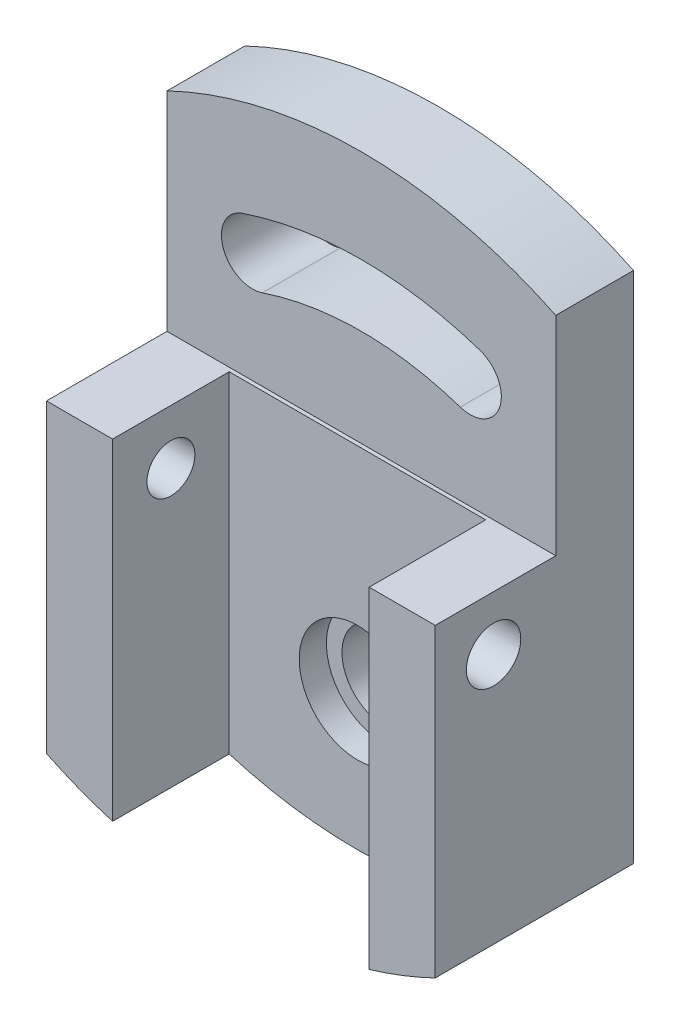
ISO-10303-21;
HEADER;
FILE_DESCRIPTION(('STEP AP214'),'2;1');
FILE_NAME('part.step','',(''),(''),'','','');
FILE_SCHEMA(('AUTOMOTIVE_DESIGN { 1 0 10303 214 1 1 1 1 }'));
ENDSEC;
DATA;
#1=APPLICATION_CONTEXT('core data for automotive mechanical design processes');
#2=APPLICATION_PROTOCOL_DEFINITION('international standard','automotive_design',2000,#1);
#3=PRODUCT_CONTEXT('',#1,'mechanical');
#4=PRODUCT('Part','Part','',(#3));
#5=PRODUCT_RELATED_PRODUCT_CATEGORY('part','',(#4));
#6=PRODUCT_DEFINITION_FORMATION('','',#4);
#7=PRODUCT_DEFINITION_CONTEXT('part definition',#1,'design');
#8=PRODUCT_DEFINITION('design','',#6,#7);
#9=PRODUCT_DEFINITION_SHAPE('','',#8);
#10=(LENGTH_UNIT() NAMED_UNIT(*) SI_UNIT(.MILLI.,.METRE.));
#11=(NAMED_UNIT(*) PLANE_ANGLE_UNIT() SI_UNIT($,.RADIAN.));
#12=(NAMED_UNIT(*) SI_UNIT($,.STERADIAN.) SOLID_ANGLE_UNIT());
#13=UNCERTAINTY_MEASURE_WITH_UNIT(LENGTH_MEASURE(1.E-05),#10,'distance_accuracy_value','');
#14=(GEOMETRIC_REPRESENTATION_CONTEXT(3) GLOBAL_UNCERTAINTY_ASSIGNED_CONTEXT((#13)) GLOBAL_UNIT_ASSIGNED_CONTEXT((#10,
#11,#12)) REPRESENTATION_CONTEXT('',''));
#15=CARTESIAN_POINT('',(0.,0.,0.));
#16=DIRECTION('',(0.,0.,1.));
#17=DIRECTION('',(1.,0.,0.));
#18=AXIS2_PLACEMENT_3D('',#15,#16,#17);
#19=CARTESIAN_POINT('',(0.,0.,20.));
#20=DIRECTION('',(0.,0.,1.));
#21=DIRECTION('',(1.,0.,0.));
#22=AXIS2_PLACEMENT_3D('',#19,#20,#21);
#23=PLANE('',#22);
#24=DIRECTION('',(0.,-1.,0.));
#25=VECTOR('',#24,1.);
#26=CARTESIAN_POINT('',(-50.,0.,20.));
#27=LINE('',#26,#25);
#28=CARTESIAN_POINT('',(-50.,108.56157588604,20.));
#29=VERTEX_POINT('',#28);
#30=CARTESIAN_POINT('',(-50.,55.,20.));
#31=VERTEX_POINT('',#30);
#32=EDGE_CURVE('E217',#29,#31,#27,.T.);
#33=ORIENTED_EDGE('',*,*,#32,.T.);
#34=DIRECTION('',(-1.,0.,0.));
#35=VECTOR('',#34,1.);
#36=CARTESIAN_POINT('',(50.,55.,20.));
#37=LINE('',#36,#35);
#38=CARTESIAN_POINT('',(50.,55.,20.));
#39=VERTEX_POINT('',#38);
#40=EDGE_CURVE('E179',#39,#31,#37,.T.);
#41=ORIENTED_EDGE('',*,*,#40,.F.);
#42=DIRECTION('',(0.,-1.,0.));
#43=VECTOR('',#42,1.);
#44=CARTESIAN_POINT('',(50.,0.,20.));
#45=LINE('',#44,#43);
#46=CARTESIAN_POINT('',(50.,108.56157588604,20.));
#47=VERTEX_POINT('',#46);
#48=EDGE_CURVE('E222',#47,#39,#45,.T.);
#49=ORIENTED_EDGE('',*,*,#48,.F.);
#50=CARTESIAN_POINT('',(0.,4.99999999999999,20.));
#51=DIRECTION('',(0.,0.,1.));
#52=DIRECTION('',(1.,0.,0.));
#53=AXIS2_PLACEMENT_3D('',#50,#51,#52);
#54=CIRCLE('',#53,115.);
#55=EDGE_CURVE('E213',#29,#47,#54,.F.);
#56=ORIENTED_EDGE('',*,*,#55,.F.);
#57=EDGE_LOOP('',(#33,#41,#49,#56));
#58=FACE_BOUND('',#57,.T.);
#59=CARTESIAN_POINT('',(28.,83.4266144584569,20.));
#60=DIRECTION('',(0.,0.,1.));
#61=DIRECTION('',(1.,0.,0.));
#62=AXIS2_PLACEMENT_3D('',#59,#60,#61);
#63=CIRCLE('',#62,7.99999999999999);
#64=CARTESIAN_POINT('',(25.4545454545455,75.8423767804153,20.));
#65=VERTEX_POINT('',#64);
#66=CARTESIAN_POINT('',(30.5454545454545,91.0108521364984,20.));
#67=VERTEX_POINT('',#66);
#68=EDGE_CURVE('E61',#65,#67,#63,.T.);
#69=ORIENTED_EDGE('',*,*,#68,.F.);
#70=CARTESIAN_POINT('',(0.,0.,20.));
#71=DIRECTION('',(0.,0.,-1.));
#72=DIRECTION('',(1.,0.,0.));
#73=AXIS2_PLACEMENT_3D('',#70,#71,#72);
#74=CIRCLE('',#73,80.);
#75=CARTESIAN_POINT('',(-25.4545454545455,75.8423767804153,20.));
#76=VERTEX_POINT('',#75);
#77=EDGE_CURVE('E289',#76,#65,#74,.T.);
#78=ORIENTED_EDGE('',*,*,#77,.F.);
#79=CARTESIAN_POINT('',(-28.,83.4266144584568,20.));
#80=DIRECTION('',(0.,0.,1.));
#81=DIRECTION('',(1.,0.,0.));
#82=AXIS2_PLACEMENT_3D('',#79,#80,#81);
#83=CIRCLE('',#82,7.99999999999999);
#84=CARTESIAN_POINT('',(-30.5454545454545,91.0108521364983,20.));
#85=VERTEX_POINT('',#84);
#86=EDGE_CURVE('E306',#85,#76,#83,.T.);
#87=ORIENTED_EDGE('',*,*,#86,.F.);
#88=CARTESIAN_POINT('',(0.,0.,20.));
#89=DIRECTION('',(0.,0.,1.));
#90=DIRECTION('',(1.,0.,0.));
#91=AXIS2_PLACEMENT_3D('',#88,#89,#90);
#92=CIRCLE('',#91,96.);
#93=EDGE_CURVE('E302',#67,#85,#92,.T.);
#94=ORIENTED_EDGE('',*,*,#93,.F.);
#95=EDGE_LOOP('',(#69,#78,#87,#94));
#96=FACE_BOUND('',#95,.T.);
#97=ADVANCED_FACE('F44',(#58,#96),#23,.T.);
#98=CARTESIAN_POINT('',(0.,4.99999999999999,20.));
#99=DIRECTION('',(0.,0.,-1.));
#100=DIRECTION('',(-1.,0.,0.));
#101=AXIS2_PLACEMENT_3D('',#98,#99,#100);
#102=CYLINDRICAL_SURFACE('',#101,115.);
#103=CARTESIAN_POINT('',(0.,4.99999999999999,0.));
#104=DIRECTION('',(0.,0.,1.));
#105=DIRECTION('',(1.,0.,0.));
#106=AXIS2_PLACEMENT_3D('',#103,#104,#105);
#107=CIRCLE('',#106,115.);
#108=CARTESIAN_POINT('',(-50.,108.56157588604,0.));
#109=VERTEX_POINT('',#108);
#110=CARTESIAN_POINT('',(50.,108.56157588604,0.));
#111=VERTEX_POINT('',#110);
#112=EDGE_CURVE('E212',#109,#111,#107,.F.);
#113=ORIENTED_EDGE('',*,*,#112,.F.);
#114=DIRECTION('',(0.,0.,-1.));
#115=VECTOR('',#114,1.);
#116=CARTESIAN_POINT('',(-50.,108.56157588604,20.));
#117=LINE('',#116,#115);
#118=EDGE_CURVE('E12',#29,#109,#117,.T.);
#119=ORIENTED_EDGE('',*,*,#118,.F.);
#120=ORIENTED_EDGE('',*,*,#55,.T.);
#121=DIRECTION('',(0.,0.,-1.));
#122=VECTOR('',#121,1.);
#123=CARTESIAN_POINT('',(50.,108.56157588604,20.));
#124=LINE('',#123,#122);
#125=EDGE_CURVE('E226',#47,#111,#124,.T.);
#126=ORIENTED_EDGE('',*,*,#125,.T.);
#127=EDGE_LOOP('',(#113,#119,#120,#126));
#128=FACE_BOUND('',#127,.T.);
#129=ADVANCED_FACE('F46',(#128),#102,.T.);
#130=CARTESIAN_POINT('',(-50.,0.,20.));
#131=DIRECTION('',(1.,0.,0.));
#132=DIRECTION('',(0.,1.,0.));
#133=AXIS2_PLACEMENT_3D('',#130,#131,#132);
#134=PLANE('',#133);
#135=CARTESIAN_POINT('',(-50.,41.,36.));
#136=DIRECTION('',(-1.,0.,0.));
#137=DIRECTION('',(0.,-1.,0.));
#138=AXIS2_PLACEMENT_3D('',#135,#136,#137);
#139=CIRCLE('',#138,6.);
#140=CARTESIAN_POINT('',(-50.,35.,36.));
#141=VERTEX_POINT('',#140);
#142=EDGE_CURVE('E316',#141,#141,#139,.T.);
#143=ORIENTED_EDGE('',*,*,#142,.F.);
#144=EDGE_LOOP('',(#143));
#145=FACE_BOUND('',#144,.T.);
#146=DIRECTION('',(0.,-1.,0.));
#147=VECTOR('',#146,1.);
#148=CARTESIAN_POINT('',(-50.,0.,0.));
#149=LINE('',#148,#147);
#150=CARTESIAN_POINT('',(-50.,-23.5615758860399,0.));
#151=VERTEX_POINT('',#150);
#152=EDGE_CURVE('E230',#109,#151,#149,.T.);
#153=ORIENTED_EDGE('',*,*,#152,.T.);
#154=DIRECTION('',(0.,0.,-1.));
#155=VECTOR('',#154,1.);
#156=CARTESIAN_POINT('',(-50.,-23.5615758860399,20.));
#157=LINE('',#156,#155);
#158=CARTESIAN_POINT('',(-50.,-23.5615758860399,51.));
#159=VERTEX_POINT('',#158);
#160=EDGE_CURVE('E54',#159,#151,#157,.T.);
#161=ORIENTED_EDGE('',*,*,#160,.F.);
#162=DIRECTION('',(0.,-1.,0.));
#163=VECTOR('',#162,1.);
#164=CARTESIAN_POINT('',(-50.,55.,51.));
#165=LINE('',#164,#163);
#166=CARTESIAN_POINT('',(-50.,55.,51.));
#167=VERTEX_POINT('',#166);
#168=EDGE_CURVE('E182',#167,#159,#165,.T.);
#169=ORIENTED_EDGE('',*,*,#168,.F.);
#170=DIRECTION('',(0.,0.,-1.));
#171=VECTOR('',#170,1.);
#172=CARTESIAN_POINT('',(-50.,55.,51.));
#173=LINE('',#172,#171);
#174=EDGE_CURVE('E174',#167,#31,#173,.T.);
#175=ORIENTED_EDGE('',*,*,#174,.T.);
#176=ORIENTED_EDGE('',*,*,#32,.F.);
#177=ORIENTED_EDGE('',*,*,#118,.T.);
#178=EDGE_LOOP('',(#153,#161,#169,#175,#176,#177));
#179=FACE_BOUND('',#178,.T.);
#180=ADVANCED_FACE('F358',(#145,#179),#134,.F.);
#181=CARTESIAN_POINT('',(0.,80.,20.));
#182=DIRECTION('',(0.,0.,-1.));
#183=DIRECTION('',(-1.,0.,0.));
#184=AXIS2_PLACEMENT_3D('',#181,#182,#183);
#185=CYLINDRICAL_SURFACE('',#184,115.);
#186=CARTESIAN_POINT('',(0.,80.,0.));
#187=DIRECTION('',(0.,0.,1.));
#188=DIRECTION('',(1.,0.,0.));
#189=AXIS2_PLACEMENT_3D('',#186,#187,#188);
#190=CIRCLE('',#189,115.);
#191=CARTESIAN_POINT('',(50.,-23.5615758860399,0.));
#192=VERTEX_POINT('',#191);
#193=EDGE_CURVE('E233',#151,#192,#190,.T.);
#194=ORIENTED_EDGE('',*,*,#193,.T.);
#195=DIRECTION('',(0.,0.,-1.));
#196=VECTOR('',#195,1.);
#197=CARTESIAN_POINT('',(50.,-23.5615758860399,20.));
#198=LINE('',#197,#196);
#199=CARTESIAN_POINT('',(50.,-23.5615758860399,51.));
#200=VERTEX_POINT('',#199);
#201=EDGE_CURVE('E242',#200,#192,#198,.T.);
#202=ORIENTED_EDGE('',*,*,#201,.F.);
#203=CARTESIAN_POINT('',(0.,80.,51.));
#204=DIRECTION('',(0.,0.,1.));
#205=DIRECTION('',(-1.,0.,0.));
#206=AXIS2_PLACEMENT_3D('',#203,#204,#205);
#207=CIRCLE('',#206,115.);
#208=CARTESIAN_POINT('',(33.,-30.1635148313633,51.));
#209=VERTEX_POINT('',#208);
#210=EDGE_CURVE('E186',#209,#200,#207,.T.);
#211=ORIENTED_EDGE('',*,*,#210,.F.);
#212=DIRECTION('',(0.,0.,-1.));
#213=VECTOR('',#212,1.);
#214=CARTESIAN_POINT('',(33.,-30.1635148313633,51.));
#215=LINE('',#214,#213);
#216=CARTESIAN_POINT('',(33.,-30.1635148313633,21.));
#217=VERTEX_POINT('',#216);
#218=EDGE_CURVE('E199',#209,#217,#215,.T.);
#219=ORIENTED_EDGE('',*,*,#218,.T.);
#220=CARTESIAN_POINT('',(0.,80.,21.));
#221=DIRECTION('',(0.,0.,1.));
#222=DIRECTION('',(1.,0.,0.));
#223=AXIS2_PLACEMENT_3D('',#220,#221,#222);
#224=CIRCLE('',#223,115.);
#225=CARTESIAN_POINT('',(-33.,-30.1635148313633,21.));
#226=VERTEX_POINT('',#225);
#227=EDGE_CURVE('E168',#226,#217,#224,.T.);
#228=ORIENTED_EDGE('',*,*,#227,.F.);
#229=DIRECTION('',(0.,0.,-1.));
#230=VECTOR('',#229,1.);
#231=CARTESIAN_POINT('',(-33.,-30.1635148313633,51.));
#232=LINE('',#231,#230);
#233=CARTESIAN_POINT('',(-33.,-30.1635148313633,51.));
#234=VERTEX_POINT('',#233);
#235=EDGE_CURVE('E166',#234,#226,#232,.T.);
#236=ORIENTED_EDGE('',*,*,#235,.F.);
#237=CARTESIAN_POINT('',(0.,80.,51.));
#238=DIRECTION('',(0.,0.,1.));
#239=DIRECTION('',(1.,0.,0.));
#240=AXIS2_PLACEMENT_3D('',#237,#238,#239);
#241=CIRCLE('',#240,115.);
#242=EDGE_CURVE('E253',#159,#234,#241,.T.);
#243=ORIENTED_EDGE('',*,*,#242,.F.);
#244=ORIENTED_EDGE('',*,*,#160,.T.);
#245=EDGE_LOOP('',(#194,#202,#211,#219,#228,#236,#243,#244));
#246=FACE_BOUND('',#245,.T.);
#247=ADVANCED_FACE('F251',(#246),#185,.T.);
#248=CARTESIAN_POINT('',(50.,0.,20.));
#249=DIRECTION('',(1.,0.,0.));
#250=DIRECTION('',(0.,1.,0.));
#251=AXIS2_PLACEMENT_3D('',#248,#249,#250);
#252=PLANE('',#251);
#253=CARTESIAN_POINT('',(50.,41.,36.));
#254=DIRECTION('',(1.,0.,0.));
#255=DIRECTION('',(0.,1.,0.));
#256=AXIS2_PLACEMENT_3D('',#253,#254,#255);
#257=CIRCLE('',#256,7.);
#258=CARTESIAN_POINT('',(50.,48.,36.));
#259=VERTEX_POINT('',#258);
#260=EDGE_CURVE('E328',#259,#259,#257,.T.);
#261=ORIENTED_EDGE('',*,*,#260,.F.);
#262=EDGE_LOOP('',(#261));
#263=FACE_BOUND('',#262,.T.);
#264=DIRECTION('',(0.,-1.,0.));
#265=VECTOR('',#264,1.);
#266=CARTESIAN_POINT('',(50.,0.,0.));
#267=LINE('',#266,#265);
#268=EDGE_CURVE('E218',#111,#192,#267,.T.);
#269=ORIENTED_EDGE('',*,*,#268,.F.);
#270=ORIENTED_EDGE('',*,*,#125,.F.);
#271=ORIENTED_EDGE('',*,*,#48,.T.);
#272=DIRECTION('',(0.,0.,-1.));
#273=VECTOR('',#272,1.);
#274=CARTESIAN_POINT('',(50.,55.,51.));
#275=LINE('',#274,#273);
#276=CARTESIAN_POINT('',(50.,55.,51.));
#277=VERTEX_POINT('',#276);
#278=EDGE_CURVE('E208',#277,#39,#275,.T.);
#279=ORIENTED_EDGE('',*,*,#278,.F.);
#280=DIRECTION('',(0.,1.,0.));
#281=VECTOR('',#280,1.);
#282=CARTESIAN_POINT('',(50.,55.,51.));
#283=LINE('',#282,#281);
#284=EDGE_CURVE('E190',#200,#277,#283,.T.);
#285=ORIENTED_EDGE('',*,*,#284,.F.);
#286=ORIENTED_EDGE('',*,*,#201,.T.);
#287=EDGE_LOOP('',(#269,#270,#271,#279,#285,#286));
#288=FACE_BOUND('',#287,.T.);
#289=ADVANCED_FACE('F263',(#263,#288),#252,.T.);
#290=CARTESIAN_POINT('',(0.,0.,0.));
#291=DIRECTION('',(0.,0.,1.));
#292=DIRECTION('',(1.,0.,0.));
#293=AXIS2_PLACEMENT_3D('',#290,#291,#292);
#294=PLANE('',#293);
#295=CARTESIAN_POINT('',(0.,0.,0.));
#296=DIRECTION('',(0.,0.,-1.));
#297=DIRECTION('',(1.,0.,0.));
#298=AXIS2_PLACEMENT_3D('',#295,#296,#297);
#299=CIRCLE('',#298,80.);
#300=CARTESIAN_POINT('',(-25.4545454545455,75.8423767804153,0.));
#301=VERTEX_POINT('',#300);
#302=CARTESIAN_POINT('',(25.4545454545455,75.8423767804153,0.));
#303=VERTEX_POINT('',#302);
#304=EDGE_CURVE('E295',#301,#303,#299,.T.);
#305=ORIENTED_EDGE('',*,*,#304,.T.);
#306=CARTESIAN_POINT('',(28.,83.4266144584569,0.));
#307=DIRECTION('',(0.,0.,1.));
#308=DIRECTION('',(1.,0.,0.));
#309=AXIS2_PLACEMENT_3D('',#306,#307,#308);
#310=CIRCLE('',#309,7.99999999999999);
#311=CARTESIAN_POINT('',(30.5454545454545,91.0108521364984,0.));
#312=VERTEX_POINT('',#311);
#313=EDGE_CURVE('E284',#303,#312,#310,.T.);
#314=ORIENTED_EDGE('',*,*,#313,.T.);
#315=CARTESIAN_POINT('',(0.,0.,0.));
#316=DIRECTION('',(0.,0.,1.));
#317=DIRECTION('',(1.,0.,0.));
#318=AXIS2_PLACEMENT_3D('',#315,#316,#317);
#319=CIRCLE('',#318,96.);
#320=CARTESIAN_POINT('',(-30.5454545454545,91.0108521364983,0.));
#321=VERTEX_POINT('',#320);
#322=EDGE_CURVE('E288',#312,#321,#319,.T.);
#323=ORIENTED_EDGE('',*,*,#322,.T.);
#324=CARTESIAN_POINT('',(-28.,83.4266144584568,0.));
#325=DIRECTION('',(0.,0.,1.));
#326=DIRECTION('',(1.,0.,0.));
#327=AXIS2_PLACEMENT_3D('',#324,#325,#326);
#328=CIRCLE('',#327,7.99999999999999);
#329=EDGE_CURVE('E69',#321,#301,#328,.T.);
#330=ORIENTED_EDGE('',*,*,#329,.T.);
#331=EDGE_LOOP('',(#305,#314,#323,#330));
#332=FACE_BOUND('',#331,.T.);
#333=CARTESIAN_POINT('',(0.,0.,0.));
#334=DIRECTION('',(0.,0.,1.));
#335=DIRECTION('',(1.,0.,0.));
#336=AXIS2_PLACEMENT_3D('',#333,#334,#335);
#337=CIRCLE('',#336,11.);
#338=CARTESIAN_POINT('',(11.,0.,0.));
#339=VERTEX_POINT('',#338);
#340=EDGE_CURVE('E336',#339,#339,#337,.T.);
#341=ORIENTED_EDGE('',*,*,#340,.T.);
#342=EDGE_LOOP('',(#341));
#343=FACE_BOUND('',#342,.T.);
#344=ORIENTED_EDGE('',*,*,#112,.T.);
#345=ORIENTED_EDGE('',*,*,#268,.T.);
#346=ORIENTED_EDGE('',*,*,#193,.F.);
#347=ORIENTED_EDGE('',*,*,#152,.F.);
#348=EDGE_LOOP('',(#344,#345,#346,#347));
#349=FACE_BOUND('',#348,.T.);
#350=ADVANCED_FACE('F259',(#332,#343,#349),#294,.F.);
#351=CARTESIAN_POINT('',(50.,55.,51.));
#352=DIRECTION('',(0.,-1.,0.));
#353=DIRECTION('',(0.,0.,-1.));
#354=AXIS2_PLACEMENT_3D('',#351,#352,#353);
#355=PLANE('',#354);
#356=ORIENTED_EDGE('',*,*,#40,.T.);
#357=ORIENTED_EDGE('',*,*,#174,.F.);
#358=DIRECTION('',(-1.,0.,0.));
#359=VECTOR('',#358,1.);
#360=CARTESIAN_POINT('',(-50.,55.,51.));
#361=LINE('',#360,#359);
#362=CARTESIAN_POINT('',(-33.,55.,51.));
#363=VERTEX_POINT('',#362);
#364=EDGE_CURVE('E172',#363,#167,#361,.T.);
#365=ORIENTED_EDGE('',*,*,#364,.F.);
#366=DIRECTION('',(0.,0.,-1.));
#367=VECTOR('',#366,1.);
#368=CARTESIAN_POINT('',(-33.,55.,51.));
#369=LINE('',#368,#367);
#370=CARTESIAN_POINT('',(-33.,55.,21.));
#371=VERTEX_POINT('',#370);
#372=EDGE_CURVE('E163',#363,#371,#369,.T.);
#373=ORIENTED_EDGE('',*,*,#372,.T.);
#374=DIRECTION('',(1.,0.,0.));
#375=VECTOR('',#374,1.);
#376=CARTESIAN_POINT('',(0.,55.,21.));
#377=LINE('',#376,#375);
#378=CARTESIAN_POINT('',(33.,55.,21.));
#379=VERTEX_POINT('',#378);
#380=EDGE_CURVE('E145',#371,#379,#377,.T.);
#381=ORIENTED_EDGE('',*,*,#380,.T.);
#382=DIRECTION('',(0.,0.,-1.));
#383=VECTOR('',#382,1.);
#384=CARTESIAN_POINT('',(33.,55.,51.));
#385=LINE('',#384,#383);
#386=CARTESIAN_POINT('',(33.,55.,51.));
#387=VERTEX_POINT('',#386);
#388=EDGE_CURVE('E205',#387,#379,#385,.T.);
#389=ORIENTED_EDGE('',*,*,#388,.F.);
#390=DIRECTION('',(-1.,0.,0.));
#391=VECTOR('',#390,1.);
#392=CARTESIAN_POINT('',(50.,55.,51.));
#393=LINE('',#392,#391);
#394=EDGE_CURVE('E193',#277,#387,#393,.T.);
#395=ORIENTED_EDGE('',*,*,#394,.F.);
#396=ORIENTED_EDGE('',*,*,#278,.T.);
#397=EDGE_LOOP('',(#356,#357,#365,#373,#381,#389,#395,#396));
#398=FACE_BOUND('',#397,.T.);
#399=ADVANCED_FACE('F170',(#398),#355,.F.);
#400=CARTESIAN_POINT('',(33.,55.,51.));
#401=DIRECTION('',(1.,0.,0.));
#402=DIRECTION('',(0.,1.,0.));
#403=AXIS2_PLACEMENT_3D('',#400,#401,#402);
#404=PLANE('',#403);
#405=CARTESIAN_POINT('',(33.,41.,36.));
#406=DIRECTION('',(1.,0.,0.));
#407=DIRECTION('',(0.,1.,0.));
#408=AXIS2_PLACEMENT_3D('',#405,#406,#407);
#409=CIRCLE('',#408,6.83);
#410=CARTESIAN_POINT('',(33.,47.83,36.));
#411=VERTEX_POINT('',#410);
#412=EDGE_CURVE('E332',#411,#411,#409,.T.);
#413=ORIENTED_EDGE('',*,*,#412,.T.);
#414=EDGE_LOOP('',(#413));
#415=FACE_BOUND('',#414,.T.);
#416=ORIENTED_EDGE('',*,*,#388,.T.);
#417=DIRECTION('',(0.,1.,0.));
#418=VECTOR('',#417,1.);
#419=CARTESIAN_POINT('',(33.,0.,21.));
#420=LINE('',#419,#418);
#421=EDGE_CURVE('E152',#217,#379,#420,.T.);
#422=ORIENTED_EDGE('',*,*,#421,.F.);
#423=ORIENTED_EDGE('',*,*,#218,.F.);
#424=DIRECTION('',(0.,-1.,0.));
#425=VECTOR('',#424,1.);
#426=CARTESIAN_POINT('',(33.,55.,51.));
#427=LINE('',#426,#425);
#428=EDGE_CURVE('E196',#387,#209,#427,.T.);
#429=ORIENTED_EDGE('',*,*,#428,.F.);
#430=EDGE_LOOP('',(#416,#422,#423,#429));
#431=FACE_BOUND('',#430,.T.);
#432=ADVANCED_FACE('F273',(#415,#431),#404,.F.);
#433=CARTESIAN_POINT('',(0.,80.,51.));
#434=DIRECTION('',(0.,0.,-1.));
#435=DIRECTION('',(-1.,0.,0.));
#436=AXIS2_PLACEMENT_3D('',#433,#434,#435);
#437=PLANE('',#436);
#438=ORIENTED_EDGE('',*,*,#210,.T.);
#439=ORIENTED_EDGE('',*,*,#284,.T.);
#440=ORIENTED_EDGE('',*,*,#394,.T.);
#441=ORIENTED_EDGE('',*,*,#428,.T.);
#442=EDGE_LOOP('',(#438,#439,#440,#441));
#443=FACE_BOUND('',#442,.T.);
#444=ADVANCED_FACE('F269',(#443),#437,.F.);
#445=CARTESIAN_POINT('',(-33.,55.,51.));
#446=DIRECTION('',(-1.,0.,0.));
#447=DIRECTION('',(0.,-1.,0.));
#448=AXIS2_PLACEMENT_3D('',#445,#446,#447);
#449=PLANE('',#448);
#450=CARTESIAN_POINT('',(-33.,41.,36.));
#451=DIRECTION('',(-1.,0.,0.));
#452=DIRECTION('',(0.,-1.,0.));
#453=AXIS2_PLACEMENT_3D('',#450,#451,#452);
#454=CIRCLE('',#453,6.17);
#455=CARTESIAN_POINT('',(-33.,34.83,36.));
#456=VERTEX_POINT('',#455);
#457=EDGE_CURVE('E48',#456,#456,#454,.T.);
#458=ORIENTED_EDGE('',*,*,#457,.T.);
#459=EDGE_LOOP('',(#458));
#460=FACE_BOUND('',#459,.T.);
#461=ORIENTED_EDGE('',*,*,#235,.T.);
#462=DIRECTION('',(0.,-1.,0.));
#463=VECTOR('',#462,1.);
#464=CARTESIAN_POINT('',(-33.,0.,21.));
#465=LINE('',#464,#463);
#466=EDGE_CURVE('E149',#371,#226,#465,.T.);
#467=ORIENTED_EDGE('',*,*,#466,.F.);
#468=ORIENTED_EDGE('',*,*,#372,.F.);
#469=DIRECTION('',(0.,1.,0.));
#470=VECTOR('',#469,1.);
#471=CARTESIAN_POINT('',(-33.,55.,51.));
#472=LINE('',#471,#470);
#473=EDGE_CURVE('E350',#234,#363,#472,.T.);
#474=ORIENTED_EDGE('',*,*,#473,.F.);
#475=EDGE_LOOP('',(#461,#467,#468,#474));
#476=FACE_BOUND('',#475,.T.);
#477=ADVANCED_FACE('F162',(#460,#476),#449,.F.);
#478=CARTESIAN_POINT('',(0.,80.,51.));
#479=DIRECTION('',(0.,0.,1.));
#480=DIRECTION('',(1.,0.,0.));
#481=AXIS2_PLACEMENT_3D('',#478,#479,#480);
#482=PLANE('',#481);
#483=ORIENTED_EDGE('',*,*,#242,.T.);
#484=ORIENTED_EDGE('',*,*,#473,.T.);
#485=ORIENTED_EDGE('',*,*,#364,.T.);
#486=ORIENTED_EDGE('',*,*,#168,.T.);
#487=EDGE_LOOP('',(#483,#484,#485,#486));
#488=FACE_BOUND('',#487,.T.);
#489=ADVANCED_FACE('F357',(#488),#482,.T.);
#490=CARTESIAN_POINT('',(0.,0.,14.));
#491=DIRECTION('',(0.,0.,1.));
#492=DIRECTION('',(1.,0.,0.));
#493=AXIS2_PLACEMENT_3D('',#490,#491,#492);
#494=CYLINDRICAL_SURFACE('',#493,15.);
#495=CARTESIAN_POINT('',(0.,0.,14.));
#496=DIRECTION('',(0.,0.,1.));
#497=DIRECTION('',(1.,0.,0.));
#498=AXIS2_PLACEMENT_3D('',#495,#496,#497);
#499=CIRCLE('',#498,15.);
#500=CARTESIAN_POINT('',(15.,0.,14.));
#501=VERTEX_POINT('',#500);
#502=EDGE_CURVE('E344',#501,#501,#499,.T.);
#503=ORIENTED_EDGE('',*,*,#502,.F.);
#504=EDGE_LOOP('',(#503));
#505=FACE_BOUND('',#504,.T.);
#506=CARTESIAN_POINT('',(0.,0.,21.));
#507=DIRECTION('',(0.,0.,1.));
#508=DIRECTION('',(1.,0.,0.));
#509=AXIS2_PLACEMENT_3D('',#506,#507,#508);
#510=CIRCLE('',#509,15.);
#511=CARTESIAN_POINT('',(15.,0.,21.));
#512=VERTEX_POINT('',#511);
#513=EDGE_CURVE('E275',#512,#512,#510,.F.);
#514=ORIENTED_EDGE('',*,*,#513,.F.);
#515=EDGE_LOOP('',(#514));
#516=FACE_BOUND('',#515,.T.);
#517=ADVANCED_FACE('F426',(#505,#516),#494,.F.);
#518=CARTESIAN_POINT('',(0.,0.,14.));
#519=DIRECTION('',(0.,0.,1.));
#520=DIRECTION('',(1.,0.,0.));
#521=AXIS2_PLACEMENT_3D('',#518,#519,#520);
#522=PLANE('',#521);
#523=CARTESIAN_POINT('',(0.,0.,14.));
#524=DIRECTION('',(0.,0.,1.));
#525=DIRECTION('',(1.,0.,0.));
#526=AXIS2_PLACEMENT_3D('',#523,#524,#525);
#527=CIRCLE('',#526,11.);
#528=CARTESIAN_POINT('',(11.,0.,14.));
#529=VERTEX_POINT('',#528);
#530=EDGE_CURVE('E340',#529,#529,#527,.T.);
#531=ORIENTED_EDGE('',*,*,#530,.F.);
#532=EDGE_LOOP('',(#531));
#533=FACE_BOUND('',#532,.T.);
#534=ORIENTED_EDGE('',*,*,#502,.T.);
#535=EDGE_LOOP('',(#534));
#536=FACE_BOUND('',#535,.T.);
#537=ADVANCED_FACE('F433',(#533,#536),#522,.T.);
#538=CARTESIAN_POINT('',(0.,0.,0.));
#539=DIRECTION('',(0.,0.,1.));
#540=DIRECTION('',(1.,0.,0.));
#541=AXIS2_PLACEMENT_3D('',#538,#539,#540);
#542=CYLINDRICAL_SURFACE('',#541,11.);
#543=ORIENTED_EDGE('',*,*,#530,.T.);
#544=EDGE_LOOP('',(#543));
#545=FACE_BOUND('',#544,.T.);
#546=ORIENTED_EDGE('',*,*,#340,.F.);
#547=EDGE_LOOP('',(#546));
#548=FACE_BOUND('',#547,.T.);
#549=ADVANCED_FACE('F441',(#545,#548),#542,.F.);
#550=CARTESIAN_POINT('',(-50.,41.,36.));
#551=DIRECTION('',(1.,0.,0.));
#552=DIRECTION('',(0.,1.,0.));
#553=AXIS2_PLACEMENT_3D('',#550,#551,#552);
#554=CONICAL_SURFACE('',#553,6.,0.00999966668666519);
#555=ORIENTED_EDGE('',*,*,#142,.T.);
#556=EDGE_LOOP('',(#555));
#557=FACE_BOUND('',#556,.T.);
#558=ORIENTED_EDGE('',*,*,#457,.F.);
#559=EDGE_LOOP('',(#558));
#560=FACE_BOUND('',#559,.T.);
#561=ADVANCED_FACE('F449',(#557,#560),#554,.F.);
#562=ORIENTED_EDGE('',*,*,#260,.T.);
#563=EDGE_LOOP('',(#562));
#564=FACE_BOUND('',#563,.T.);
#565=ORIENTED_EDGE('',*,*,#412,.F.);
#566=EDGE_LOOP('',(#565));
#567=FACE_BOUND('',#566,.T.);
#568=ADVANCED_FACE('F457',(#564,#567),#554,.F.);
#569=CARTESIAN_POINT('',(28.,83.4266144584569,0.));
#570=DIRECTION('',(0.,0.,1.));
#571=DIRECTION('',(1.,0.,0.));
#572=AXIS2_PLACEMENT_3D('',#569,#570,#571);
#573=CYLINDRICAL_SURFACE('',#572,7.99999999999999);
#574=ORIENTED_EDGE('',*,*,#68,.T.);
#575=DIRECTION('',(0.,0.,1.));
#576=VECTOR('',#575,1.);
#577=CARTESIAN_POINT('',(30.5454545454545,91.0108521364984,0.));
#578=LINE('',#577,#576);
#579=EDGE_CURVE('E299',#312,#67,#578,.T.);
#580=ORIENTED_EDGE('',*,*,#579,.F.);
#581=ORIENTED_EDGE('',*,*,#313,.F.);
#582=DIRECTION('',(0.,0.,1.));
#583=VECTOR('',#582,1.);
#584=CARTESIAN_POINT('',(25.4545454545455,75.8423767804153,0.));
#585=LINE('',#584,#583);
#586=EDGE_CURVE('E313',#303,#65,#585,.T.);
#587=ORIENTED_EDGE('',*,*,#586,.T.);
#588=EDGE_LOOP('',(#574,#580,#581,#587));
#589=FACE_BOUND('',#588,.T.);
#590=ADVANCED_FACE('F465',(#589),#573,.F.);
#591=CARTESIAN_POINT('',(0.,0.,0.));
#592=DIRECTION('',(0.,0.,1.));
#593=DIRECTION('',(1.,0.,0.));
#594=AXIS2_PLACEMENT_3D('',#591,#592,#593);
#595=CYLINDRICAL_SURFACE('',#594,80.);
#596=ORIENTED_EDGE('',*,*,#77,.T.);
#597=ORIENTED_EDGE('',*,*,#586,.F.);
#598=ORIENTED_EDGE('',*,*,#304,.F.);
#599=DIRECTION('',(0.,0.,1.));
#600=VECTOR('',#599,1.);
#601=CARTESIAN_POINT('',(-25.4545454545455,75.8423767804153,0.));
#602=LINE('',#601,#600);
#603=EDGE_CURVE('E317',#301,#76,#602,.T.);
#604=ORIENTED_EDGE('',*,*,#603,.T.);
#605=EDGE_LOOP('',(#596,#597,#598,#604));
#606=FACE_BOUND('',#605,.T.);
#607=ADVANCED_FACE('F472',(#606),#595,.T.);
#608=CARTESIAN_POINT('',(-28.,83.4266144584568,0.));
#609=DIRECTION('',(0.,0.,1.));
#610=DIRECTION('',(1.,0.,0.));
#611=AXIS2_PLACEMENT_3D('',#608,#609,#610);
#612=CYLINDRICAL_SURFACE('',#611,7.99999999999999);
#613=ORIENTED_EDGE('',*,*,#86,.T.);
#614=ORIENTED_EDGE('',*,*,#603,.F.);
#615=ORIENTED_EDGE('',*,*,#329,.F.);
#616=DIRECTION('',(0.,0.,1.));
#617=VECTOR('',#616,1.);
#618=CARTESIAN_POINT('',(-30.5454545454545,91.0108521364983,0.));
#619=LINE('',#618,#617);
#620=EDGE_CURVE('E320',#321,#85,#619,.T.);
#621=ORIENTED_EDGE('',*,*,#620,.T.);
#622=EDGE_LOOP('',(#613,#614,#615,#621));
#623=FACE_BOUND('',#622,.T.);
#624=ADVANCED_FACE('F479',(#623),#612,.F.);
#625=CARTESIAN_POINT('',(0.,0.,0.));
#626=DIRECTION('',(0.,0.,1.));
#627=DIRECTION('',(1.,0.,0.));
#628=AXIS2_PLACEMENT_3D('',#625,#626,#627);
#629=CYLINDRICAL_SURFACE('',#628,96.);
#630=ORIENTED_EDGE('',*,*,#93,.T.);
#631=ORIENTED_EDGE('',*,*,#620,.F.);
#632=ORIENTED_EDGE('',*,*,#322,.F.);
#633=ORIENTED_EDGE('',*,*,#579,.T.);
#634=EDGE_LOOP('',(#630,#631,#632,#633));
#635=FACE_BOUND('',#634,.T.);
#636=ADVANCED_FACE('F487',(#635),#629,.F.);
#637=CARTESIAN_POINT('',(0.,0.,21.));
#638=DIRECTION('',(0.,0.,1.));
#639=DIRECTION('',(1.,0.,0.));
#640=AXIS2_PLACEMENT_3D('',#637,#638,#639);
#641=PLANE('',#640);
#642=ORIENTED_EDGE('',*,*,#380,.F.);
#643=ORIENTED_EDGE('',*,*,#466,.T.);
#644=ORIENTED_EDGE('',*,*,#227,.T.);
#645=ORIENTED_EDGE('',*,*,#421,.T.);
#646=EDGE_LOOP('',(#642,#643,#644,#645));
#647=FACE_BOUND('',#646,.T.);
#648=ORIENTED_EDGE('',*,*,#513,.T.);
#649=EDGE_LOOP('',(#648));
#650=FACE_BOUND('',#649,.T.);
#651=ADVANCED_FACE('F147',(#647,#650),#641,.T.);
#652=CLOSED_SHELL('',(#97,#129,#180,#247,#289,#350,#399,#432,#444,#477,#489,#517,#537,#549,#561,
#568,#590,#607,#624,#636,#651));
#653=MANIFOLD_SOLID_BREP('B2',#652);
#654=ADVANCED_BREP_SHAPE_REPRESENTATION('',(#18,#653),#14);
#655=SHAPE_DEFINITION_REPRESENTATION(#9,#654);
ENDSEC;
END-ISO-10303-21;
